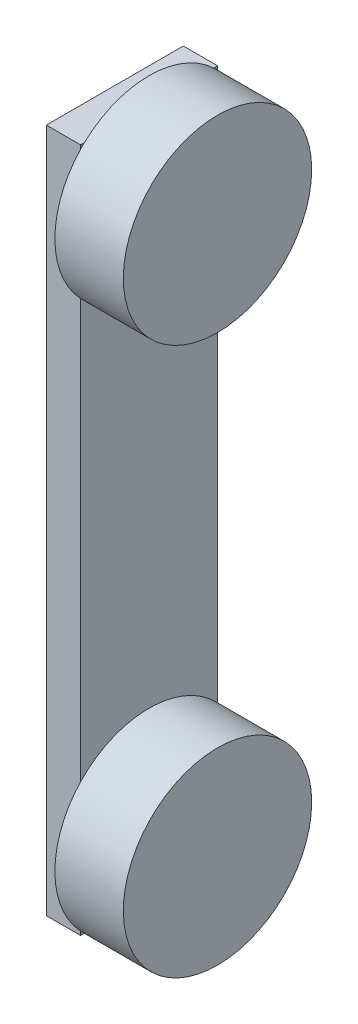
ISO-10303-21;
HEADER;
FILE_DESCRIPTION(('STEP AP214'),'2;1');
FILE_NAME('part.step','',(''),(''),'','','');
FILE_SCHEMA(('AUTOMOTIVE_DESIGN { 1 0 10303 214 1 1 1 1 }'));
ENDSEC;
DATA;
#1=APPLICATION_CONTEXT('core data for automotive mechanical design processes');
#2=APPLICATION_PROTOCOL_DEFINITION('international standard','automotive_design',2000,#1);
#3=PRODUCT_CONTEXT('',#1,'mechanical');
#4=PRODUCT('Part','Part','',(#3));
#5=PRODUCT_RELATED_PRODUCT_CATEGORY('part','',(#4));
#6=PRODUCT_DEFINITION_FORMATION('','',#4);
#7=PRODUCT_DEFINITION_CONTEXT('part definition',#1,'design');
#8=PRODUCT_DEFINITION('design','',#6,#7);
#9=PRODUCT_DEFINITION_SHAPE('','',#8);
#10=(LENGTH_UNIT() NAMED_UNIT(*) SI_UNIT(.MILLI.,.METRE.));
#11=(NAMED_UNIT(*) PLANE_ANGLE_UNIT() SI_UNIT($,.RADIAN.));
#12=(NAMED_UNIT(*) SI_UNIT($,.STERADIAN.) SOLID_ANGLE_UNIT());
#13=UNCERTAINTY_MEASURE_WITH_UNIT(LENGTH_MEASURE(1.E-05),#10,'distance_accuracy_value','');
#14=(GEOMETRIC_REPRESENTATION_CONTEXT(3) GLOBAL_UNCERTAINTY_ASSIGNED_CONTEXT((#13)) GLOBAL_UNIT_ASSIGNED_CONTEXT((#10,
#11,#12)) REPRESENTATION_CONTEXT('',''));
#15=CARTESIAN_POINT('',(0.,0.,0.));
#16=DIRECTION('',(0.,0.,1.));
#17=DIRECTION('',(1.,0.,0.));
#18=AXIS2_PLACEMENT_3D('',#15,#16,#17);
#19=CARTESIAN_POINT('',(6.35,0.,0.));
#20=DIRECTION('',(-1.,0.,0.));
#21=DIRECTION('',(0.,0.,1.));
#22=AXIS2_PLACEMENT_3D('',#19,#20,#21);
#23=PLANE('',#22);
#24=CARTESIAN_POINT('',(6.35,-101.6,0.));
#25=DIRECTION('',(-1.,0.,0.));
#26=DIRECTION('',(0.,0.,1.));
#27=AXIS2_PLACEMENT_3D('',#24,#25,#26);
#28=CIRCLE('',#27,34.925);
#29=CARTESIAN_POINT('',(6.35,-125.570724331985,25.4));
#30=VERTEX_POINT('',#29);
#31=CARTESIAN_POINT('',(6.35,-127.,23.9707243319847));
#32=VERTEX_POINT('',#31);
#33=EDGE_CURVE('E11',#30,#32,#28,.F.);
#34=ORIENTED_EDGE('',*,*,#33,.F.);
#35=DIRECTION('',(0.,-1.,0.));
#36=VECTOR('',#35,1.);
#37=CARTESIAN_POINT('',(6.35,-127.,25.4));
#38=LINE('',#37,#36);
#39=CARTESIAN_POINT('',(6.35,-127.,25.4));
#40=VERTEX_POINT('',#39);
#41=EDGE_CURVE('E126',#30,#40,#38,.T.);
#42=ORIENTED_EDGE('',*,*,#41,.T.);
#43=DIRECTION('',(0.,0.,-1.));
#44=VECTOR('',#43,1.);
#45=CARTESIAN_POINT('',(6.35,-127.,25.4));
#46=LINE('',#45,#44);
#47=EDGE_CURVE('E154',#40,#32,#46,.T.);
#48=ORIENTED_EDGE('',*,*,#47,.T.);
#49=EDGE_LOOP('',(#34,#42,#48));
#50=FACE_BOUND('',#49,.T.);
#51=ADVANCED_FACE('F35',(#50),#23,.F.);
#52=CARTESIAN_POINT('',(6.35,-127.,-23.9707243319847));
#53=VERTEX_POINT('',#52);
#54=CARTESIAN_POINT('',(6.35,-125.570724331985,-25.4));
#55=VERTEX_POINT('',#54);
#56=EDGE_CURVE('E43',#53,#55,#28,.F.);
#57=ORIENTED_EDGE('',*,*,#56,.F.);
#58=CARTESIAN_POINT('',(6.35,-127.,-25.4));
#59=VERTEX_POINT('',#58);
#60=EDGE_CURVE('E155',#53,#59,#46,.T.);
#61=ORIENTED_EDGE('',*,*,#60,.T.);
#62=DIRECTION('',(0.,1.,0.));
#63=VECTOR('',#62,1.);
#64=CARTESIAN_POINT('',(6.35,-127.,-25.4));
#65=LINE('',#64,#63);
#66=EDGE_CURVE('E213',#59,#55,#65,.T.);
#67=ORIENTED_EDGE('',*,*,#66,.T.);
#68=EDGE_LOOP('',(#57,#61,#67));
#69=FACE_BOUND('',#68,.T.);
#70=ADVANCED_FACE('F233',(#69),#23,.F.);
#71=CARTESIAN_POINT('',(6.35,101.6,0.));
#72=DIRECTION('',(1.,0.,0.));
#73=DIRECTION('',(0.,0.,-1.));
#74=AXIS2_PLACEMENT_3D('',#71,#72,#73);
#75=CIRCLE('',#74,34.925);
#76=CARTESIAN_POINT('',(6.35,125.570724331985,-25.4));
#77=VERTEX_POINT('',#76);
#78=CARTESIAN_POINT('',(6.35,127.,-23.9707243319846));
#79=VERTEX_POINT('',#78);
#80=EDGE_CURVE('E186',#77,#79,#75,.T.);
#81=ORIENTED_EDGE('',*,*,#80,.F.);
#82=CARTESIAN_POINT('',(6.35,127.,-25.4));
#83=VERTEX_POINT('',#82);
#84=EDGE_CURVE('E171',#77,#83,#65,.T.);
#85=ORIENTED_EDGE('',*,*,#84,.T.);
#86=DIRECTION('',(0.,0.,1.));
#87=VECTOR('',#86,1.);
#88=CARTESIAN_POINT('',(6.35,127.,25.4));
#89=LINE('',#88,#87);
#90=EDGE_CURVE('E205',#83,#79,#89,.T.);
#91=ORIENTED_EDGE('',*,*,#90,.T.);
#92=EDGE_LOOP('',(#81,#85,#91));
#93=FACE_BOUND('',#92,.T.);
#94=ADVANCED_FACE('F223',(#93),#23,.F.);
#95=CARTESIAN_POINT('',(6.35,127.,23.9707243319846));
#96=VERTEX_POINT('',#95);
#97=CARTESIAN_POINT('',(6.35,125.570724331985,25.4));
#98=VERTEX_POINT('',#97);
#99=EDGE_CURVE('E184',#96,#98,#75,.T.);
#100=ORIENTED_EDGE('',*,*,#99,.F.);
#101=CARTESIAN_POINT('',(6.35,127.,25.4));
#102=VERTEX_POINT('',#101);
#103=EDGE_CURVE('E209',#96,#102,#89,.T.);
#104=ORIENTED_EDGE('',*,*,#103,.T.);
#105=EDGE_CURVE('E158',#102,#98,#38,.T.);
#106=ORIENTED_EDGE('',*,*,#105,.T.);
#107=EDGE_LOOP('',(#100,#104,#106));
#108=FACE_BOUND('',#107,.T.);
#109=ADVANCED_FACE('F241',(#108),#23,.F.);
#110=CARTESIAN_POINT('',(6.35,-127.,-25.4));
#111=DIRECTION('',(0.,0.,1.));
#112=DIRECTION('',(1.,0.,0.));
#113=AXIS2_PLACEMENT_3D('',#110,#111,#112);
#114=PLANE('',#113);
#115=DIRECTION('',(0.,1.,0.));
#116=VECTOR('',#115,1.);
#117=CARTESIAN_POINT('',(-6.35,-127.,-25.4));
#118=LINE('',#117,#116);
#119=CARTESIAN_POINT('',(-6.35,-127.,-25.4));
#120=VERTEX_POINT('',#119);
#121=CARTESIAN_POINT('',(-6.35,127.,-25.4));
#122=VERTEX_POINT('',#121);
#123=EDGE_CURVE('E161',#120,#122,#118,.T.);
#124=ORIENTED_EDGE('',*,*,#123,.T.);
#125=DIRECTION('',(-1.,0.,0.));
#126=VECTOR('',#125,1.);
#127=CARTESIAN_POINT('',(6.35,127.,-25.4));
#128=LINE('',#127,#126);
#129=EDGE_CURVE('E179',#83,#122,#128,.T.);
#130=ORIENTED_EDGE('',*,*,#129,.F.);
#131=ORIENTED_EDGE('',*,*,#84,.F.);
#132=CARTESIAN_POINT('',(6.35,77.6292756680154,-25.4));
#133=VERTEX_POINT('',#132);
#134=EDGE_CURVE('E217',#133,#77,#65,.T.);
#135=ORIENTED_EDGE('',*,*,#134,.F.);
#136=CARTESIAN_POINT('',(6.35,-77.6292756680154,-25.4));
#137=VERTEX_POINT('',#136);
#138=EDGE_CURVE('E216',#137,#133,#65,.T.);
#139=ORIENTED_EDGE('',*,*,#138,.F.);
#140=EDGE_CURVE('E57',#55,#137,#65,.T.);
#141=ORIENTED_EDGE('',*,*,#140,.F.);
#142=ORIENTED_EDGE('',*,*,#66,.F.);
#143=DIRECTION('',(-1.,0.,0.));
#144=VECTOR('',#143,1.);
#145=CARTESIAN_POINT('',(6.35,-127.,-25.4));
#146=LINE('',#145,#144);
#147=EDGE_CURVE('E157',#59,#120,#146,.T.);
#148=ORIENTED_EDGE('',*,*,#147,.T.);
#149=EDGE_LOOP('',(#124,#130,#131,#135,#139,#141,#142,#148));
#150=FACE_BOUND('',#149,.T.);
#151=ADVANCED_FACE('F37',(#150),#114,.F.);
#152=CARTESIAN_POINT('',(6.35,127.,25.4));
#153=DIRECTION('',(0.,-1.,0.));
#154=DIRECTION('',(0.,0.,-1.));
#155=AXIS2_PLACEMENT_3D('',#152,#153,#154);
#156=PLANE('',#155);
#157=DIRECTION('',(0.,0.,1.));
#158=VECTOR('',#157,1.);
#159=CARTESIAN_POINT('',(-6.35,127.,25.4));
#160=LINE('',#159,#158);
#161=CARTESIAN_POINT('',(-6.35,127.,25.4));
#162=VERTEX_POINT('',#161);
#163=EDGE_CURVE('E164',#122,#162,#160,.T.);
#164=ORIENTED_EDGE('',*,*,#163,.T.);
#165=DIRECTION('',(-1.,0.,0.));
#166=VECTOR('',#165,1.);
#167=CARTESIAN_POINT('',(6.35,127.,25.4));
#168=LINE('',#167,#166);
#169=EDGE_CURVE('E177',#102,#162,#168,.T.);
#170=ORIENTED_EDGE('',*,*,#169,.F.);
#171=ORIENTED_EDGE('',*,*,#103,.F.);
#172=EDGE_CURVE('E208',#79,#96,#89,.T.);
#173=ORIENTED_EDGE('',*,*,#172,.F.);
#174=ORIENTED_EDGE('',*,*,#90,.F.);
#175=ORIENTED_EDGE('',*,*,#129,.T.);
#176=EDGE_LOOP('',(#164,#170,#171,#173,#174,#175));
#177=FACE_BOUND('',#176,.T.);
#178=ADVANCED_FACE('F224',(#177),#156,.F.);
#179=CARTESIAN_POINT('',(6.35,-127.,25.4));
#180=DIRECTION('',(0.,0.,-1.));
#181=DIRECTION('',(-1.,0.,0.));
#182=AXIS2_PLACEMENT_3D('',#179,#180,#181);
#183=PLANE('',#182);
#184=DIRECTION('',(0.,-1.,0.));
#185=VECTOR('',#184,1.);
#186=CARTESIAN_POINT('',(-6.35,-127.,25.4));
#187=LINE('',#186,#185);
#188=CARTESIAN_POINT('',(-6.35,-127.,25.4));
#189=VERTEX_POINT('',#188);
#190=EDGE_CURVE('E167',#162,#189,#187,.T.);
#191=ORIENTED_EDGE('',*,*,#190,.T.);
#192=DIRECTION('',(-1.,0.,0.));
#193=VECTOR('',#192,1.);
#194=CARTESIAN_POINT('',(6.35,-127.,25.4));
#195=LINE('',#194,#193);
#196=EDGE_CURVE('E174',#40,#189,#195,.T.);
#197=ORIENTED_EDGE('',*,*,#196,.F.);
#198=ORIENTED_EDGE('',*,*,#41,.F.);
#199=CARTESIAN_POINT('',(6.35,-77.6292756680154,25.4));
#200=VERTEX_POINT('',#199);
#201=EDGE_CURVE('E119',#200,#30,#38,.T.);
#202=ORIENTED_EDGE('',*,*,#201,.F.);
#203=CARTESIAN_POINT('',(6.35,77.6292756680153,25.4));
#204=VERTEX_POINT('',#203);
#205=EDGE_CURVE('E111',#204,#200,#38,.T.);
#206=ORIENTED_EDGE('',*,*,#205,.F.);
#207=EDGE_CURVE('E118',#98,#204,#38,.T.);
#208=ORIENTED_EDGE('',*,*,#207,.F.);
#209=ORIENTED_EDGE('',*,*,#105,.F.);
#210=ORIENTED_EDGE('',*,*,#169,.T.);
#211=EDGE_LOOP('',(#191,#197,#198,#202,#206,#208,#209,#210));
#212=FACE_BOUND('',#211,.T.);
#213=ADVANCED_FACE('F124',(#212),#183,.F.);
#214=CARTESIAN_POINT('',(6.35,-127.,25.4));
#215=DIRECTION('',(0.,1.,0.));
#216=DIRECTION('',(0.,0.,1.));
#217=AXIS2_PLACEMENT_3D('',#214,#215,#216);
#218=PLANE('',#217);
#219=DIRECTION('',(0.,0.,-1.));
#220=VECTOR('',#219,1.);
#221=CARTESIAN_POINT('',(-6.35,-127.,25.4));
#222=LINE('',#221,#220);
#223=EDGE_CURVE('E169',#189,#120,#222,.T.);
#224=ORIENTED_EDGE('',*,*,#223,.T.);
#225=ORIENTED_EDGE('',*,*,#147,.F.);
#226=ORIENTED_EDGE('',*,*,#60,.F.);
#227=EDGE_CURVE('E149',#32,#53,#46,.T.);
#228=ORIENTED_EDGE('',*,*,#227,.F.);
#229=ORIENTED_EDGE('',*,*,#47,.F.);
#230=ORIENTED_EDGE('',*,*,#196,.T.);
#231=EDGE_LOOP('',(#224,#225,#226,#228,#229,#230));
#232=FACE_BOUND('',#231,.T.);
#233=ADVANCED_FACE('F231',(#232),#218,.F.);
#234=CARTESIAN_POINT('',(6.35,-101.6,0.));
#235=DIRECTION('',(1.,0.,0.));
#236=DIRECTION('',(0.,0.,-1.));
#237=AXIS2_PLACEMENT_3D('',#234,#235,#236);
#238=CIRCLE('',#237,34.925);
#239=EDGE_CURVE('E50',#137,#200,#238,.T.);
#240=ORIENTED_EDGE('',*,*,#239,.F.);
#241=ORIENTED_EDGE('',*,*,#138,.T.);
#242=EDGE_CURVE('E115',#204,#133,#75,.T.);
#243=ORIENTED_EDGE('',*,*,#242,.F.);
#244=ORIENTED_EDGE('',*,*,#205,.T.);
#245=EDGE_LOOP('',(#240,#241,#243,#244));
#246=FACE_BOUND('',#245,.T.);
#247=ADVANCED_FACE('F113',(#246),#23,.F.);
#248=CARTESIAN_POINT('',(-6.35,0.,0.));
#249=DIRECTION('',(-1.,0.,0.));
#250=DIRECTION('',(0.,0.,1.));
#251=AXIS2_PLACEMENT_3D('',#248,#249,#250);
#252=PLANE('',#251);
#253=ORIENTED_EDGE('',*,*,#123,.F.);
#254=ORIENTED_EDGE('',*,*,#223,.F.);
#255=ORIENTED_EDGE('',*,*,#190,.F.);
#256=ORIENTED_EDGE('',*,*,#163,.F.);
#257=EDGE_LOOP('',(#253,#254,#255,#256));
#258=FACE_BOUND('',#257,.T.);
#259=ADVANCED_FACE('F229',(#258),#252,.T.);
#260=CARTESIAN_POINT('',(6.35,101.6,0.));
#261=DIRECTION('',(1.,0.,0.));
#262=DIRECTION('',(0.,0.,-1.));
#263=AXIS2_PLACEMENT_3D('',#260,#261,#262);
#264=PLANE('',#263);
#265=EDGE_CURVE('E141',#133,#77,#75,.T.);
#266=ORIENTED_EDGE('',*,*,#265,.F.);
#267=ORIENTED_EDGE('',*,*,#134,.T.);
#268=EDGE_LOOP('',(#266,#267));
#269=FACE_BOUND('',#268,.T.);
#270=ADVANCED_FACE('F246',(#269),#264,.F.);
#271=EDGE_CURVE('E191',#79,#96,#75,.T.);
#272=ORIENTED_EDGE('',*,*,#271,.F.);
#273=ORIENTED_EDGE('',*,*,#172,.T.);
#274=EDGE_LOOP('',(#272,#273));
#275=FACE_BOUND('',#274,.T.);
#276=ADVANCED_FACE('F254',(#275),#264,.F.);
#277=EDGE_CURVE('E196',#98,#204,#75,.T.);
#278=ORIENTED_EDGE('',*,*,#277,.F.);
#279=ORIENTED_EDGE('',*,*,#207,.T.);
#280=EDGE_LOOP('',(#278,#279));
#281=FACE_BOUND('',#280,.T.);
#282=ADVANCED_FACE('F201',(#281),#264,.F.);
#283=CARTESIAN_POINT('',(31.75,101.6,0.));
#284=DIRECTION('',(-1.,0.,0.));
#285=DIRECTION('',(0.,0.,1.));
#286=AXIS2_PLACEMENT_3D('',#283,#284,#285);
#287=CYLINDRICAL_SURFACE('',#286,34.925);
#288=CARTESIAN_POINT('',(31.75,101.6,0.));
#289=DIRECTION('',(1.,0.,0.));
#290=DIRECTION('',(0.,0.,-1.));
#291=AXIS2_PLACEMENT_3D('',#288,#289,#290);
#292=CIRCLE('',#291,34.925);
#293=CARTESIAN_POINT('',(31.75,101.6,-34.925));
#294=VERTEX_POINT('',#293);
#295=EDGE_CURVE('E165',#294,#294,#292,.T.);
#296=ORIENTED_EDGE('',*,*,#295,.F.);
#297=EDGE_LOOP('',(#296));
#298=FACE_BOUND('',#297,.T.);
#299=ORIENTED_EDGE('',*,*,#80,.T.);
#300=ORIENTED_EDGE('',*,*,#271,.T.);
#301=ORIENTED_EDGE('',*,*,#99,.T.);
#302=ORIENTED_EDGE('',*,*,#277,.T.);
#303=ORIENTED_EDGE('',*,*,#242,.T.);
#304=ORIENTED_EDGE('',*,*,#265,.T.);
#305=EDGE_LOOP('',(#299,#300,#301,#302,#303,#304));
#306=FACE_BOUND('',#305,.T.);
#307=ADVANCED_FACE('F199',(#298,#306),#287,.T.);
#308=CARTESIAN_POINT('',(31.75,101.6,0.));
#309=DIRECTION('',(1.,0.,0.));
#310=DIRECTION('',(0.,0.,-1.));
#311=AXIS2_PLACEMENT_3D('',#308,#309,#310);
#312=PLANE('',#311);
#313=ORIENTED_EDGE('',*,*,#295,.T.);
#314=EDGE_LOOP('',(#313));
#315=FACE_BOUND('',#314,.T.);
#316=ADVANCED_FACE('F262',(#315),#312,.T.);
#317=CARTESIAN_POINT('',(6.35,-101.6,0.));
#318=DIRECTION('',(1.,0.,0.));
#319=DIRECTION('',(0.,0.,-1.));
#320=AXIS2_PLACEMENT_3D('',#317,#318,#319);
#321=PLANE('',#320);
#322=EDGE_CURVE('E138',#55,#137,#238,.T.);
#323=ORIENTED_EDGE('',*,*,#322,.F.);
#324=ORIENTED_EDGE('',*,*,#140,.T.);
#325=EDGE_LOOP('',(#323,#324));
#326=FACE_BOUND('',#325,.T.);
#327=ADVANCED_FACE('F269',(#326),#321,.F.);
#328=EDGE_CURVE('E129',#200,#30,#238,.T.);
#329=ORIENTED_EDGE('',*,*,#328,.F.);
#330=ORIENTED_EDGE('',*,*,#201,.T.);
#331=EDGE_LOOP('',(#329,#330));
#332=FACE_BOUND('',#331,.T.);
#333=ADVANCED_FACE('F130',(#332),#321,.F.);
#334=EDGE_CURVE('E132',#32,#53,#238,.T.);
#335=ORIENTED_EDGE('',*,*,#334,.F.);
#336=ORIENTED_EDGE('',*,*,#227,.T.);
#337=EDGE_LOOP('',(#335,#336));
#338=FACE_BOUND('',#337,.T.);
#339=ADVANCED_FACE('F148',(#338),#321,.F.);
#340=CARTESIAN_POINT('',(31.75,-101.6,0.));
#341=DIRECTION('',(-1.,0.,0.));
#342=DIRECTION('',(0.,0.,1.));
#343=AXIS2_PLACEMENT_3D('',#340,#341,#342);
#344=CYLINDRICAL_SURFACE('',#343,34.925);
#345=CARTESIAN_POINT('',(31.75,-101.6,0.));
#346=DIRECTION('',(1.,0.,0.));
#347=DIRECTION('',(0.,0.,-1.));
#348=AXIS2_PLACEMENT_3D('',#345,#346,#347);
#349=CIRCLE('',#348,34.925);
#350=CARTESIAN_POINT('',(31.75,-101.6,-34.925));
#351=VERTEX_POINT('',#350);
#352=EDGE_CURVE('E139',#351,#351,#349,.T.);
#353=ORIENTED_EDGE('',*,*,#352,.F.);
#354=EDGE_LOOP('',(#353));
#355=FACE_BOUND('',#354,.T.);
#356=ORIENTED_EDGE('',*,*,#239,.T.);
#357=ORIENTED_EDGE('',*,*,#328,.T.);
#358=ORIENTED_EDGE('',*,*,#33,.T.);
#359=ORIENTED_EDGE('',*,*,#334,.T.);
#360=ORIENTED_EDGE('',*,*,#56,.T.);
#361=ORIENTED_EDGE('',*,*,#322,.T.);
#362=EDGE_LOOP('',(#356,#357,#358,#359,#360,#361));
#363=FACE_BOUND('',#362,.T.);
#364=ADVANCED_FACE('F135',(#355,#363),#344,.T.);
#365=CARTESIAN_POINT('',(31.75,-101.6,0.));
#366=DIRECTION('',(1.,0.,0.));
#367=DIRECTION('',(0.,0.,-1.));
#368=AXIS2_PLACEMENT_3D('',#365,#366,#367);
#369=PLANE('',#368);
#370=ORIENTED_EDGE('',*,*,#352,.T.);
#371=EDGE_LOOP('',(#370));
#372=FACE_BOUND('',#371,.T.);
#373=ADVANCED_FACE('F285',(#372),#369,.T.);
#374=CLOSED_SHELL('',(#51,#70,#94,#109,#151,#178,#213,#233,#247,#259,#270,#276,#282,#307,#316,
#327,#333,#339,#364,#373));
#375=MANIFOLD_SOLID_BREP('B2',#374);
#376=ADVANCED_BREP_SHAPE_REPRESENTATION('',(#18,#375),#14);
#377=SHAPE_DEFINITION_REPRESENTATION(#9,#376);
ENDSEC;
END-ISO-10303-21;
